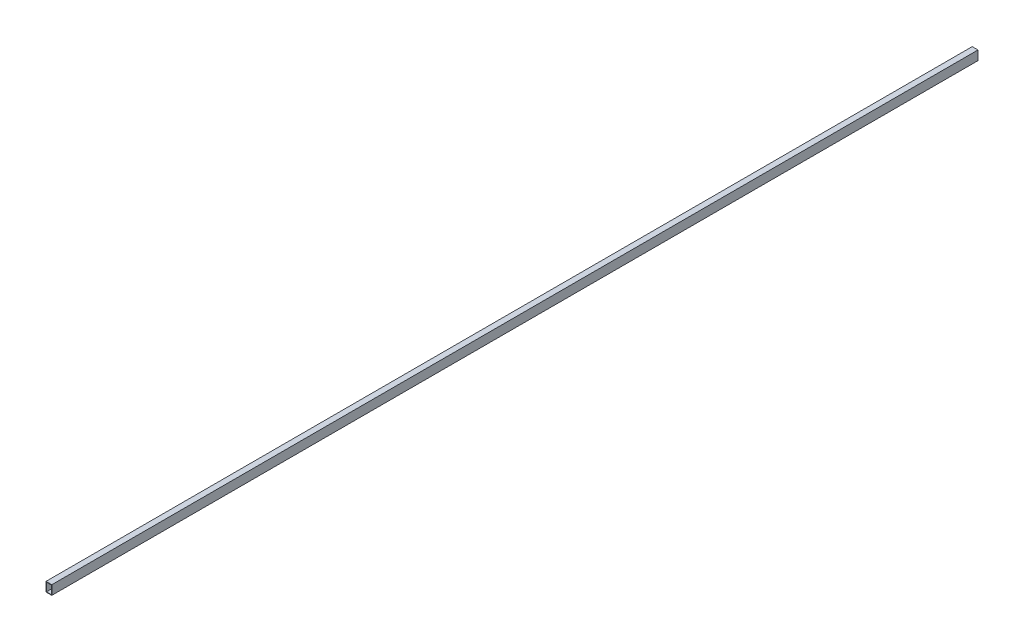
ISO-10303-21;
HEADER;
FILE_DESCRIPTION(('STEP AP214'),'2;1');
FILE_NAME('part.step','',(''),(''),'','','');
FILE_SCHEMA(('AUTOMOTIVE_DESIGN { 1 0 10303 214 1 1 1 1 }'));
ENDSEC;
DATA;
#1=APPLICATION_CONTEXT('core data for automotive mechanical design processes');
#2=APPLICATION_PROTOCOL_DEFINITION('international standard','automotive_design',2000,#1);
#3=PRODUCT_CONTEXT('',#1,'mechanical');
#4=PRODUCT('Part','Part','',(#3));
#5=PRODUCT_RELATED_PRODUCT_CATEGORY('part','',(#4));
#6=PRODUCT_DEFINITION_FORMATION('','',#4);
#7=PRODUCT_DEFINITION_CONTEXT('part definition',#1,'design');
#8=PRODUCT_DEFINITION('design','',#6,#7);
#9=PRODUCT_DEFINITION_SHAPE('','',#8);
#10=(LENGTH_UNIT() NAMED_UNIT(*) SI_UNIT(.MILLI.,.METRE.));
#11=(NAMED_UNIT(*) PLANE_ANGLE_UNIT() SI_UNIT($,.RADIAN.));
#12=(NAMED_UNIT(*) SI_UNIT($,.STERADIAN.) SOLID_ANGLE_UNIT());
#13=UNCERTAINTY_MEASURE_WITH_UNIT(LENGTH_MEASURE(1.E-05),#10,'distance_accuracy_value','');
#14=(GEOMETRIC_REPRESENTATION_CONTEXT(3) GLOBAL_UNCERTAINTY_ASSIGNED_CONTEXT((#13)) GLOBAL_UNIT_ASSIGNED_CONTEXT((#10,
#11,#12)) REPRESENTATION_CONTEXT('',''));
#15=CARTESIAN_POINT('',(0.,0.,0.));
#16=DIRECTION('',(0.,0.,1.));
#17=DIRECTION('',(1.,0.,0.));
#18=AXIS2_PLACEMENT_3D('',#15,#16,#17);
#19=CARTESIAN_POINT('',(-25.,40.,8000.));
#20=DIRECTION('',(1.,0.,0.));
#21=DIRECTION('',(0.,1.,0.));
#22=AXIS2_PLACEMENT_3D('',#19,#20,#21);
#23=PLANE('',#22);
#24=DIRECTION('',(0.,-1.,0.));
#25=VECTOR('',#24,1.);
#26=CARTESIAN_POINT('',(-25.,40.,0.));
#27=LINE('',#26,#25);
#28=CARTESIAN_POINT('',(-25.,40.,0.));
#29=VERTEX_POINT('',#28);
#30=CARTESIAN_POINT('',(-25.,-40.,0.));
#31=VERTEX_POINT('',#30);
#32=EDGE_CURVE('E147',#29,#31,#27,.T.);
#33=ORIENTED_EDGE('',*,*,#32,.T.);
#34=DIRECTION('',(0.,0.,-1.));
#35=VECTOR('',#34,1.);
#36=CARTESIAN_POINT('',(-25.,-40.,8000.));
#37=LINE('',#36,#35);
#38=CARTESIAN_POINT('',(-25.,-40.,8000.));
#39=VERTEX_POINT('',#38);
#40=EDGE_CURVE('E11',#39,#31,#37,.T.);
#41=ORIENTED_EDGE('',*,*,#40,.F.);
#42=DIRECTION('',(0.,-1.,0.));
#43=VECTOR('',#42,1.);
#44=CARTESIAN_POINT('',(-25.,40.,8000.));
#45=LINE('',#44,#43);
#46=CARTESIAN_POINT('',(-25.,40.,8000.));
#47=VERTEX_POINT('',#46);
#48=EDGE_CURVE('E153',#47,#39,#45,.T.);
#49=ORIENTED_EDGE('',*,*,#48,.F.);
#50=DIRECTION('',(0.,0.,-1.));
#51=VECTOR('',#50,1.);
#52=CARTESIAN_POINT('',(-25.,40.,8000.));
#53=LINE('',#52,#51);
#54=EDGE_CURVE('E169',#47,#29,#53,.T.);
#55=ORIENTED_EDGE('',*,*,#54,.T.);
#56=EDGE_LOOP('',(#33,#41,#49,#55));
#57=FACE_BOUND('',#56,.T.);
#58=ADVANCED_FACE('F39',(#57),#23,.F.);
#59=CARTESIAN_POINT('',(-25.,-40.,8000.));
#60=DIRECTION('',(0.,1.,0.));
#61=DIRECTION('',(0.,0.,1.));
#62=AXIS2_PLACEMENT_3D('',#59,#60,#61);
#63=PLANE('',#62);
#64=DIRECTION('',(1.,0.,0.));
#65=VECTOR('',#64,1.);
#66=CARTESIAN_POINT('',(-25.,-40.,0.));
#67=LINE('',#66,#65);
#68=CARTESIAN_POINT('',(25.,-40.,0.));
#69=VERTEX_POINT('',#68);
#70=EDGE_CURVE('E173',#31,#69,#67,.T.);
#71=ORIENTED_EDGE('',*,*,#70,.T.);
#72=DIRECTION('',(0.,0.,-1.));
#73=VECTOR('',#72,1.);
#74=CARTESIAN_POINT('',(25.,-40.,8000.));
#75=LINE('',#74,#73);
#76=CARTESIAN_POINT('',(25.,-40.,8000.));
#77=VERTEX_POINT('',#76);
#78=EDGE_CURVE('E47',#77,#69,#75,.T.);
#79=ORIENTED_EDGE('',*,*,#78,.F.);
#80=DIRECTION('',(1.,0.,0.));
#81=VECTOR('',#80,1.);
#82=CARTESIAN_POINT('',(-25.,-40.,8000.));
#83=LINE('',#82,#81);
#84=EDGE_CURVE('E157',#39,#77,#83,.T.);
#85=ORIENTED_EDGE('',*,*,#84,.F.);
#86=ORIENTED_EDGE('',*,*,#40,.T.);
#87=EDGE_LOOP('',(#71,#79,#85,#86));
#88=FACE_BOUND('',#87,.T.);
#89=ADVANCED_FACE('F195',(#88),#63,.F.);
#90=CARTESIAN_POINT('',(25.,40.,8000.));
#91=DIRECTION('',(1.,0.,0.));
#92=DIRECTION('',(0.,0.,-1.));
#93=AXIS2_PLACEMENT_3D('',#90,#91,#92);
#94=PLANE('',#93);
#95=DIRECTION('',(0.,-1.,0.));
#96=VECTOR('',#95,1.);
#97=CARTESIAN_POINT('',(25.,40.,0.));
#98=LINE('',#97,#96);
#99=CARTESIAN_POINT('',(25.,40.,0.));
#100=VERTEX_POINT('',#99);
#101=EDGE_CURVE('E177',#100,#69,#98,.T.);
#102=ORIENTED_EDGE('',*,*,#101,.F.);
#103=DIRECTION('',(0.,0.,-1.));
#104=VECTOR('',#103,1.);
#105=CARTESIAN_POINT('',(25.,40.,8000.));
#106=LINE('',#105,#104);
#107=CARTESIAN_POINT('',(25.,40.,8000.));
#108=VERTEX_POINT('',#107);
#109=EDGE_CURVE('E186',#108,#100,#106,.T.);
#110=ORIENTED_EDGE('',*,*,#109,.F.);
#111=DIRECTION('',(0.,-1.,0.));
#112=VECTOR('',#111,1.);
#113=CARTESIAN_POINT('',(25.,40.,8000.));
#114=LINE('',#113,#112);
#115=EDGE_CURVE('E161',#108,#77,#114,.T.);
#116=ORIENTED_EDGE('',*,*,#115,.T.);
#117=ORIENTED_EDGE('',*,*,#78,.T.);
#118=EDGE_LOOP('',(#102,#110,#116,#117));
#119=FACE_BOUND('',#118,.T.);
#120=ADVANCED_FACE('F192',(#119),#94,.T.);
#121=CARTESIAN_POINT('',(-25.,40.,8000.));
#122=DIRECTION('',(0.,1.,0.));
#123=DIRECTION('',(0.,0.,1.));
#124=AXIS2_PLACEMENT_3D('',#121,#122,#123);
#125=PLANE('',#124);
#126=DIRECTION('',(1.,0.,0.));
#127=VECTOR('',#126,1.);
#128=CARTESIAN_POINT('',(-25.,40.,0.));
#129=LINE('',#128,#127);
#130=EDGE_CURVE('E158',#29,#100,#129,.T.);
#131=ORIENTED_EDGE('',*,*,#130,.F.);
#132=ORIENTED_EDGE('',*,*,#54,.F.);
#133=DIRECTION('',(1.,0.,0.));
#134=VECTOR('',#133,1.);
#135=CARTESIAN_POINT('',(-25.,40.,8000.));
#136=LINE('',#135,#134);
#137=EDGE_CURVE('E165',#47,#108,#136,.T.);
#138=ORIENTED_EDGE('',*,*,#137,.T.);
#139=ORIENTED_EDGE('',*,*,#109,.T.);
#140=EDGE_LOOP('',(#131,#132,#138,#139));
#141=FACE_BOUND('',#140,.T.);
#142=ADVANCED_FACE('F202',(#141),#125,.T.);
#143=CARTESIAN_POINT('',(0.,0.,8000.));
#144=DIRECTION('',(0.,0.,1.));
#145=DIRECTION('',(1.,0.,0.));
#146=AXIS2_PLACEMENT_3D('',#143,#144,#145);
#147=PLANE('',#146);
#148=DIRECTION('',(0.,1.,0.));
#149=VECTOR('',#148,1.);
#150=CARTESIAN_POINT('',(-21.,36.,8000.));
#151=LINE('',#150,#149);
#152=CARTESIAN_POINT('',(-21.,-36.,8000.));
#153=VERTEX_POINT('',#152);
#154=CARTESIAN_POINT('',(-21.,36.,8000.));
#155=VERTEX_POINT('',#154);
#156=EDGE_CURVE('E106',#153,#155,#151,.T.);
#157=ORIENTED_EDGE('',*,*,#156,.T.);
#158=DIRECTION('',(1.,0.,0.));
#159=VECTOR('',#158,1.);
#160=CARTESIAN_POINT('',(21.,36.,8000.));
#161=LINE('',#160,#159);
#162=CARTESIAN_POINT('',(21.,36.,8000.));
#163=VERTEX_POINT('',#162);
#164=EDGE_CURVE('E116',#155,#163,#161,.T.);
#165=ORIENTED_EDGE('',*,*,#164,.T.);
#166=DIRECTION('',(0.,-1.,0.));
#167=VECTOR('',#166,1.);
#168=CARTESIAN_POINT('',(21.,36.,8000.));
#169=LINE('',#168,#167);
#170=CARTESIAN_POINT('',(21.,-36.,8000.));
#171=VERTEX_POINT('',#170);
#172=EDGE_CURVE('E54',#163,#171,#169,.T.);
#173=ORIENTED_EDGE('',*,*,#172,.T.);
#174=DIRECTION('',(-1.,0.,0.));
#175=VECTOR('',#174,1.);
#176=CARTESIAN_POINT('',(21.,-36.,8000.));
#177=LINE('',#176,#175);
#178=EDGE_CURVE('E113',#171,#153,#177,.T.);
#179=ORIENTED_EDGE('',*,*,#178,.T.);
#180=EDGE_LOOP('',(#157,#165,#173,#179));
#181=FACE_BOUND('',#180,.T.);
#182=ORIENTED_EDGE('',*,*,#48,.T.);
#183=ORIENTED_EDGE('',*,*,#84,.T.);
#184=ORIENTED_EDGE('',*,*,#115,.F.);
#185=ORIENTED_EDGE('',*,*,#137,.F.);
#186=EDGE_LOOP('',(#182,#183,#184,#185));
#187=FACE_BOUND('',#186,.T.);
#188=ADVANCED_FACE('F121',(#181,#187),#147,.T.);
#189=CARTESIAN_POINT('',(0.,0.,0.));
#190=DIRECTION('',(0.,0.,1.));
#191=DIRECTION('',(1.,0.,0.));
#192=AXIS2_PLACEMENT_3D('',#189,#190,#191);
#193=PLANE('',#192);
#194=DIRECTION('',(1.,0.,0.));
#195=VECTOR('',#194,1.);
#196=CARTESIAN_POINT('',(21.,36.,0.));
#197=LINE('',#196,#195);
#198=CARTESIAN_POINT('',(-21.,36.,0.));
#199=VERTEX_POINT('',#198);
#200=CARTESIAN_POINT('',(21.,36.,0.));
#201=VERTEX_POINT('',#200);
#202=EDGE_CURVE('E138',#199,#201,#197,.T.);
#203=ORIENTED_EDGE('',*,*,#202,.F.);
#204=DIRECTION('',(0.,1.,0.));
#205=VECTOR('',#204,1.);
#206=CARTESIAN_POINT('',(-21.,36.,0.));
#207=LINE('',#206,#205);
#208=CARTESIAN_POINT('',(-21.,-36.,0.));
#209=VERTEX_POINT('',#208);
#210=EDGE_CURVE('E62',#209,#199,#207,.T.);
#211=ORIENTED_EDGE('',*,*,#210,.F.);
#212=DIRECTION('',(-1.,0.,0.));
#213=VECTOR('',#212,1.);
#214=CARTESIAN_POINT('',(21.,-36.,0.));
#215=LINE('',#214,#213);
#216=CARTESIAN_POINT('',(21.,-36.,0.));
#217=VERTEX_POINT('',#216);
#218=EDGE_CURVE('E125',#217,#209,#215,.T.);
#219=ORIENTED_EDGE('',*,*,#218,.F.);
#220=DIRECTION('',(0.,-1.,0.));
#221=VECTOR('',#220,1.);
#222=CARTESIAN_POINT('',(21.,36.,0.));
#223=LINE('',#222,#221);
#224=EDGE_CURVE('E129',#201,#217,#223,.T.);
#225=ORIENTED_EDGE('',*,*,#224,.F.);
#226=EDGE_LOOP('',(#203,#211,#219,#225));
#227=FACE_BOUND('',#226,.T.);
#228=ORIENTED_EDGE('',*,*,#32,.F.);
#229=ORIENTED_EDGE('',*,*,#130,.T.);
#230=ORIENTED_EDGE('',*,*,#101,.T.);
#231=ORIENTED_EDGE('',*,*,#70,.F.);
#232=EDGE_LOOP('',(#228,#229,#230,#231));
#233=FACE_BOUND('',#232,.T.);
#234=ADVANCED_FACE('F199',(#227,#233),#193,.F.);
#235=CARTESIAN_POINT('',(-21.,36.,8000.));
#236=DIRECTION('',(-1.,0.,0.));
#237=DIRECTION('',(0.,-1.,0.));
#238=AXIS2_PLACEMENT_3D('',#235,#236,#237);
#239=PLANE('',#238);
#240=ORIENTED_EDGE('',*,*,#210,.T.);
#241=DIRECTION('',(0.,0.,-1.));
#242=VECTOR('',#241,1.);
#243=CARTESIAN_POINT('',(-21.,36.,8000.));
#244=LINE('',#243,#242);
#245=EDGE_CURVE('E102',#155,#199,#244,.T.);
#246=ORIENTED_EDGE('',*,*,#245,.F.);
#247=ORIENTED_EDGE('',*,*,#156,.F.);
#248=DIRECTION('',(0.,0.,-1.));
#249=VECTOR('',#248,1.);
#250=CARTESIAN_POINT('',(-21.,-36.,8000.));
#251=LINE('',#250,#249);
#252=EDGE_CURVE('E144',#153,#209,#251,.T.);
#253=ORIENTED_EDGE('',*,*,#252,.T.);
#254=EDGE_LOOP('',(#240,#246,#247,#253));
#255=FACE_BOUND('',#254,.T.);
#256=ADVANCED_FACE('F104',(#255),#239,.F.);
#257=CARTESIAN_POINT('',(21.,-36.,8000.));
#258=DIRECTION('',(0.,-1.,0.));
#259=DIRECTION('',(0.,0.,-1.));
#260=AXIS2_PLACEMENT_3D('',#257,#258,#259);
#261=PLANE('',#260);
#262=ORIENTED_EDGE('',*,*,#218,.T.);
#263=ORIENTED_EDGE('',*,*,#252,.F.);
#264=ORIENTED_EDGE('',*,*,#178,.F.);
#265=DIRECTION('',(0.,0.,-1.));
#266=VECTOR('',#265,1.);
#267=CARTESIAN_POINT('',(21.,-36.,8000.));
#268=LINE('',#267,#266);
#269=EDGE_CURVE('E148',#171,#217,#268,.T.);
#270=ORIENTED_EDGE('',*,*,#269,.T.);
#271=EDGE_LOOP('',(#262,#263,#264,#270));
#272=FACE_BOUND('',#271,.T.);
#273=ADVANCED_FACE('F224',(#272),#261,.F.);
#274=CARTESIAN_POINT('',(21.,36.,8000.));
#275=DIRECTION('',(1.,0.,0.));
#276=DIRECTION('',(0.,1.,0.));
#277=AXIS2_PLACEMENT_3D('',#274,#275,#276);
#278=PLANE('',#277);
#279=ORIENTED_EDGE('',*,*,#224,.T.);
#280=ORIENTED_EDGE('',*,*,#269,.F.);
#281=ORIENTED_EDGE('',*,*,#172,.F.);
#282=DIRECTION('',(0.,0.,-1.));
#283=VECTOR('',#282,1.);
#284=CARTESIAN_POINT('',(21.,36.,8000.));
#285=LINE('',#284,#283);
#286=EDGE_CURVE('E112',#163,#201,#285,.T.);
#287=ORIENTED_EDGE('',*,*,#286,.T.);
#288=EDGE_LOOP('',(#279,#280,#281,#287));
#289=FACE_BOUND('',#288,.T.);
#290=ADVANCED_FACE('F227',(#289),#278,.F.);
#291=CARTESIAN_POINT('',(21.,36.,8000.));
#292=DIRECTION('',(0.,1.,0.));
#293=DIRECTION('',(0.,0.,1.));
#294=AXIS2_PLACEMENT_3D('',#291,#292,#293);
#295=PLANE('',#294);
#296=ORIENTED_EDGE('',*,*,#202,.T.);
#297=ORIENTED_EDGE('',*,*,#286,.F.);
#298=ORIENTED_EDGE('',*,*,#164,.F.);
#299=ORIENTED_EDGE('',*,*,#245,.T.);
#300=EDGE_LOOP('',(#296,#297,#298,#299));
#301=FACE_BOUND('',#300,.T.);
#302=ADVANCED_FACE('F117',(#301),#295,.F.);
#303=CLOSED_SHELL('',(#58,#89,#120,#142,#188,#234,#256,#273,#290,#302));
#304=MANIFOLD_SOLID_BREP('B2',#303);
#305=ADVANCED_BREP_SHAPE_REPRESENTATION('',(#18,#304),#14);
#306=SHAPE_DEFINITION_REPRESENTATION(#9,#305);
ENDSEC;
END-ISO-10303-21;
